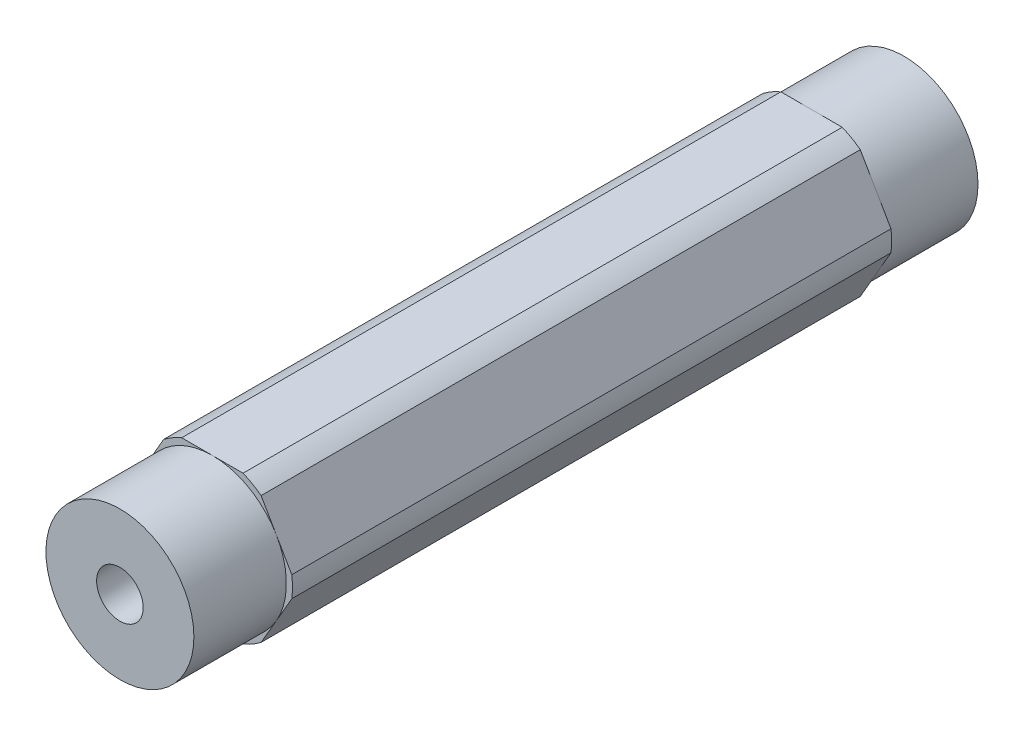
ISO-10303-21;
HEADER;
FILE_DESCRIPTION(('STEP AP214'),'2;1');
FILE_NAME('part.step','',(''),(''),'','','');
FILE_SCHEMA(('AUTOMOTIVE_DESIGN { 1 0 10303 214 1 1 1 1 }'));
ENDSEC;
DATA;
#1=APPLICATION_CONTEXT('core data for automotive mechanical design processes');
#2=APPLICATION_PROTOCOL_DEFINITION('international standard','automotive_design',2000,#1);
#3=PRODUCT_CONTEXT('',#1,'mechanical');
#4=PRODUCT('Part','Part','',(#3));
#5=PRODUCT_RELATED_PRODUCT_CATEGORY('part','',(#4));
#6=PRODUCT_DEFINITION_FORMATION('','',#4);
#7=PRODUCT_DEFINITION_CONTEXT('part definition',#1,'design');
#8=PRODUCT_DEFINITION('design','',#6,#7);
#9=PRODUCT_DEFINITION_SHAPE('','',#8);
#10=(LENGTH_UNIT() NAMED_UNIT(*) SI_UNIT(.MILLI.,.METRE.));
#11=(NAMED_UNIT(*) PLANE_ANGLE_UNIT() SI_UNIT($,.RADIAN.));
#12=(NAMED_UNIT(*) SI_UNIT($,.STERADIAN.) SOLID_ANGLE_UNIT());
#13=UNCERTAINTY_MEASURE_WITH_UNIT(LENGTH_MEASURE(1.E-05),#10,'distance_accuracy_value','');
#14=(GEOMETRIC_REPRESENTATION_CONTEXT(3) GLOBAL_UNCERTAINTY_ASSIGNED_CONTEXT((#13)) GLOBAL_UNIT_ASSIGNED_CONTEXT((#10,
#11,#12)) REPRESENTATION_CONTEXT('',''));
#15=CARTESIAN_POINT('',(0.,0.,0.));
#16=DIRECTION('',(0.,0.,1.));
#17=DIRECTION('',(1.,0.,0.));
#18=AXIS2_PLACEMENT_3D('',#15,#16,#17);
#19=CARTESIAN_POINT('',(0.,0.,-25.7175));
#20=DIRECTION('',(0.,0.,1.));
#21=DIRECTION('',(1.,0.,0.));
#22=AXIS2_PLACEMENT_3D('',#19,#20,#21);
#23=PLANE('',#22);
#24=DIRECTION('',(-0.5,0.866025403784439,0.));
#25=VECTOR('',#24,1.);
#26=CARTESIAN_POINT('',(5.49926131403118,3.175,-25.7175));
#27=LINE('',#26,#25);
#28=CARTESIAN_POINT('',(5.49926131403118,3.175,-25.7175));
#29=VERTEX_POINT('',#28);
#30=CARTESIAN_POINT('',(4.18177084608654,5.45696042896782,-25.7175));
#31=VERTEX_POINT('',#30);
#32=EDGE_CURVE('E182',#29,#31,#27,.T.);
#33=ORIENTED_EDGE('',*,*,#32,.F.);
#34=CARTESIAN_POINT('',(0.,0.,-25.7175));
#35=DIRECTION('',(0.,0.,1.));
#36=DIRECTION('',(1.,0.,0.));
#37=AXIS2_PLACEMENT_3D('',#34,#35,#36);
#38=CIRCLE('',#37,6.35);
#39=CARTESIAN_POINT('',(0.,6.35,-25.7175));
#40=VERTEX_POINT('',#39);
#41=EDGE_CURVE('E57',#29,#40,#38,.T.);
#42=ORIENTED_EDGE('',*,*,#41,.T.);
#43=DIRECTION('',(-1.,0.,0.));
#44=VECTOR('',#43,1.);
#45=CARTESIAN_POINT('',(0.,6.35,-25.7175));
#46=LINE('',#45,#44);
#47=CARTESIAN_POINT('',(2.63498093588929,6.35,-25.7175));
#48=VERTEX_POINT('',#47);
#49=EDGE_CURVE('E181',#48,#40,#46,.T.);
#50=ORIENTED_EDGE('',*,*,#49,.F.);
#51=CARTESIAN_POINT('',(0.,0.,-25.7175));
#52=DIRECTION('',(0.,0.,1.));
#53=DIRECTION('',(1.,0.,0.));
#54=AXIS2_PLACEMENT_3D('',#51,#52,#53);
#55=CIRCLE('',#54,6.874999966);
#56=EDGE_CURVE('E196',#31,#48,#55,.T.);
#57=ORIENTED_EDGE('',*,*,#56,.F.);
#58=EDGE_LOOP('',(#33,#42,#50,#57));
#59=FACE_BOUND('',#58,.T.);
#60=ADVANCED_FACE('F45',(#59),#23,.F.);
#61=CARTESIAN_POINT('',(-2.63498093588929,6.35,-25.7175));
#62=VERTEX_POINT('',#61);
#63=EDGE_CURVE('E189',#40,#62,#46,.T.);
#64=ORIENTED_EDGE('',*,*,#63,.F.);
#65=CARTESIAN_POINT('',(-5.49926131403118,3.175,-25.7175));
#66=VERTEX_POINT('',#65);
#67=EDGE_CURVE('E11',#40,#66,#38,.T.);
#68=ORIENTED_EDGE('',*,*,#67,.T.);
#69=DIRECTION('',(-0.5,-0.866025403784438,0.));
#70=VECTOR('',#69,1.);
#71=CARTESIAN_POINT('',(-5.49926131403118,3.175,-25.7175));
#72=LINE('',#71,#70);
#73=CARTESIAN_POINT('',(-4.18177084608654,5.45696042896783,-25.7175));
#74=VERTEX_POINT('',#73);
#75=EDGE_CURVE('E210',#74,#66,#72,.T.);
#76=ORIENTED_EDGE('',*,*,#75,.F.);
#77=EDGE_CURVE('E191',#62,#74,#55,.T.);
#78=ORIENTED_EDGE('',*,*,#77,.F.);
#79=EDGE_LOOP('',(#64,#68,#76,#78));
#80=FACE_BOUND('',#79,.T.);
#81=ADVANCED_FACE('F190',(#80),#23,.F.);
#82=CARTESIAN_POINT('',(-6.81675178197583,0.893039571032178,-25.7175));
#83=VERTEX_POINT('',#82);
#84=EDGE_CURVE('E205',#66,#83,#72,.T.);
#85=ORIENTED_EDGE('',*,*,#84,.F.);
#86=CARTESIAN_POINT('',(-5.49926131403118,-3.175,-25.7175));
#87=VERTEX_POINT('',#86);
#88=EDGE_CURVE('E55',#66,#87,#38,.T.);
#89=ORIENTED_EDGE('',*,*,#88,.T.);
#90=DIRECTION('',(0.5,-0.866025403784438,0.));
#91=VECTOR('',#90,1.);
#92=CARTESIAN_POINT('',(-5.49926131403118,-3.175,-25.7175));
#93=LINE('',#92,#91);
#94=CARTESIAN_POINT('',(-6.81675178197583,-0.893039571032174,-25.7175));
#95=VERTEX_POINT('',#94);
#96=EDGE_CURVE('E214',#95,#87,#93,.T.);
#97=ORIENTED_EDGE('',*,*,#96,.F.);
#98=EDGE_CURVE('E207',#83,#95,#55,.T.);
#99=ORIENTED_EDGE('',*,*,#98,.F.);
#100=EDGE_LOOP('',(#85,#89,#97,#99));
#101=FACE_BOUND('',#100,.T.);
#102=ADVANCED_FACE('F433',(#101),#23,.F.);
#103=CARTESIAN_POINT('',(-4.18177084608653,-5.45696042896783,-25.7175));
#104=VERTEX_POINT('',#103);
#105=EDGE_CURVE('E219',#87,#104,#93,.T.);
#106=ORIENTED_EDGE('',*,*,#105,.F.);
#107=CARTESIAN_POINT('',(0.,-6.35,-25.7175));
#108=VERTEX_POINT('',#107);
#109=EDGE_CURVE('E397',#87,#108,#38,.T.);
#110=ORIENTED_EDGE('',*,*,#109,.T.);
#111=DIRECTION('',(1.,0.,0.));
#112=VECTOR('',#111,1.);
#113=CARTESIAN_POINT('',(0.,-6.35,-25.7175));
#114=LINE('',#113,#112);
#115=CARTESIAN_POINT('',(-2.6349809358893,-6.35,-25.7175));
#116=VERTEX_POINT('',#115);
#117=EDGE_CURVE('E220',#116,#108,#114,.T.);
#118=ORIENTED_EDGE('',*,*,#117,.F.);
#119=EDGE_CURVE('E218',#104,#116,#55,.T.);
#120=ORIENTED_EDGE('',*,*,#119,.F.);
#121=EDGE_LOOP('',(#106,#110,#118,#120));
#122=FACE_BOUND('',#121,.T.);
#123=ADVANCED_FACE('F396',(#122),#23,.F.);
#124=CARTESIAN_POINT('',(2.6349809358893,-6.35,-25.7175));
#125=VERTEX_POINT('',#124);
#126=EDGE_CURVE('E225',#108,#125,#114,.T.);
#127=ORIENTED_EDGE('',*,*,#126,.F.);
#128=CARTESIAN_POINT('',(5.49926131403118,-3.175,-25.7175));
#129=VERTEX_POINT('',#128);
#130=EDGE_CURVE('E304',#108,#129,#38,.T.);
#131=ORIENTED_EDGE('',*,*,#130,.T.);
#132=DIRECTION('',(0.5,0.866025403784439,0.));
#133=VECTOR('',#132,1.);
#134=CARTESIAN_POINT('',(5.49926131403119,-3.175,-25.7175));
#135=LINE('',#134,#133);
#136=CARTESIAN_POINT('',(4.18177084608654,-5.45696042896782,-25.7175));
#137=VERTEX_POINT('',#136);
#138=EDGE_CURVE('E226',#137,#129,#135,.T.);
#139=ORIENTED_EDGE('',*,*,#138,.F.);
#140=EDGE_CURVE('E224',#125,#137,#55,.T.);
#141=ORIENTED_EDGE('',*,*,#140,.F.);
#142=EDGE_LOOP('',(#127,#131,#139,#141));
#143=FACE_BOUND('',#142,.T.);
#144=ADVANCED_FACE('F416',(#143),#23,.F.);
#145=CARTESIAN_POINT('',(0.,0.,25.7175));
#146=DIRECTION('',(0.,0.,1.));
#147=DIRECTION('',(1.,0.,0.));
#148=AXIS2_PLACEMENT_3D('',#145,#146,#147);
#149=PLANE('',#148);
#150=CARTESIAN_POINT('',(0.,0.,25.7175));
#151=DIRECTION('',(0.,0.,1.));
#152=DIRECTION('',(1.,0.,0.));
#153=AXIS2_PLACEMENT_3D('',#150,#151,#152);
#154=CIRCLE('',#153,6.35);
#155=CARTESIAN_POINT('',(5.49926131403118,3.175,25.7175));
#156=VERTEX_POINT('',#155);
#157=CARTESIAN_POINT('',(0.,6.35,25.7175));
#158=VERTEX_POINT('',#157);
#159=EDGE_CURVE('E280',#156,#158,#154,.T.);
#160=ORIENTED_EDGE('',*,*,#159,.F.);
#161=DIRECTION('',(-0.5,0.866025403784439,0.));
#162=VECTOR('',#161,1.);
#163=CARTESIAN_POINT('',(5.49926131403118,3.175,25.7175));
#164=LINE('',#163,#162);
#165=CARTESIAN_POINT('',(4.18177084608654,5.45696042896782,25.7175));
#166=VERTEX_POINT('',#165);
#167=EDGE_CURVE('E369',#156,#166,#164,.T.);
#168=ORIENTED_EDGE('',*,*,#167,.T.);
#169=CARTESIAN_POINT('',(0.,0.,25.7175));
#170=DIRECTION('',(0.,0.,1.));
#171=DIRECTION('',(1.,0.,0.));
#172=AXIS2_PLACEMENT_3D('',#169,#170,#171);
#173=CIRCLE('',#172,6.874999966);
#174=CARTESIAN_POINT('',(2.63498093588929,6.35,25.7175));
#175=VERTEX_POINT('',#174);
#176=EDGE_CURVE('E355',#166,#175,#173,.T.);
#177=ORIENTED_EDGE('',*,*,#176,.T.);
#178=DIRECTION('',(-1.,0.,0.));
#179=VECTOR('',#178,1.);
#180=CARTESIAN_POINT('',(0.,6.35,25.7175));
#181=LINE('',#180,#179);
#182=EDGE_CURVE('E358',#175,#158,#181,.T.);
#183=ORIENTED_EDGE('',*,*,#182,.T.);
#184=EDGE_LOOP('',(#160,#168,#177,#183));
#185=FACE_BOUND('',#184,.T.);
#186=ADVANCED_FACE('F413',(#185),#149,.T.);
#187=CARTESIAN_POINT('',(-5.49926131403118,3.175,25.7175));
#188=VERTEX_POINT('',#187);
#189=EDGE_CURVE('E291',#158,#188,#154,.T.);
#190=ORIENTED_EDGE('',*,*,#189,.F.);
#191=CARTESIAN_POINT('',(-2.63498093588929,6.35,25.7175));
#192=VERTEX_POINT('',#191);
#193=EDGE_CURVE('E359',#158,#192,#181,.T.);
#194=ORIENTED_EDGE('',*,*,#193,.T.);
#195=CARTESIAN_POINT('',(-4.18177084608654,5.45696042896783,25.7175));
#196=VERTEX_POINT('',#195);
#197=EDGE_CURVE('E362',#192,#196,#173,.T.);
#198=ORIENTED_EDGE('',*,*,#197,.T.);
#199=DIRECTION('',(-0.5,-0.866025403784438,0.));
#200=VECTOR('',#199,1.);
#201=CARTESIAN_POINT('',(-5.49926131403118,3.175,25.7175));
#202=LINE('',#201,#200);
#203=EDGE_CURVE('E338',#196,#188,#202,.T.);
#204=ORIENTED_EDGE('',*,*,#203,.T.);
#205=EDGE_LOOP('',(#190,#194,#198,#204));
#206=FACE_BOUND('',#205,.T.);
#207=ADVANCED_FACE('F415',(#206),#149,.T.);
#208=CARTESIAN_POINT('',(-5.49926131403118,-3.175,25.7175));
#209=VERTEX_POINT('',#208);
#210=EDGE_CURVE('E300',#188,#209,#154,.T.);
#211=ORIENTED_EDGE('',*,*,#210,.F.);
#212=CARTESIAN_POINT('',(-6.81675178197583,0.893039571032178,25.7175));
#213=VERTEX_POINT('',#212);
#214=EDGE_CURVE('E365',#188,#213,#202,.T.);
#215=ORIENTED_EDGE('',*,*,#214,.T.);
#216=CARTESIAN_POINT('',(-6.81675178197583,-0.893039571032174,25.7175));
#217=VERTEX_POINT('',#216);
#218=EDGE_CURVE('E323',#213,#217,#173,.T.);
#219=ORIENTED_EDGE('',*,*,#218,.T.);
#220=DIRECTION('',(0.5,-0.866025403784438,0.));
#221=VECTOR('',#220,1.);
#222=CARTESIAN_POINT('',(-5.49926131403118,-3.175,25.7175));
#223=LINE('',#222,#221);
#224=EDGE_CURVE('E320',#217,#209,#223,.T.);
#225=ORIENTED_EDGE('',*,*,#224,.T.);
#226=EDGE_LOOP('',(#211,#215,#219,#225));
#227=FACE_BOUND('',#226,.T.);
#228=ADVANCED_FACE('F326',(#227),#149,.T.);
#229=CARTESIAN_POINT('',(0.,-6.35,25.7175));
#230=VERTEX_POINT('',#229);
#231=EDGE_CURVE('E285',#209,#230,#154,.T.);
#232=ORIENTED_EDGE('',*,*,#231,.F.);
#233=CARTESIAN_POINT('',(-4.18177084608653,-5.45696042896783,25.7175));
#234=VERTEX_POINT('',#233);
#235=EDGE_CURVE('E312',#209,#234,#223,.T.);
#236=ORIENTED_EDGE('',*,*,#235,.T.);
#237=CARTESIAN_POINT('',(-2.6349809358893,-6.35,25.7175));
#238=VERTEX_POINT('',#237);
#239=EDGE_CURVE('E331',#234,#238,#173,.T.);
#240=ORIENTED_EDGE('',*,*,#239,.T.);
#241=DIRECTION('',(1.,0.,0.));
#242=VECTOR('',#241,1.);
#243=CARTESIAN_POINT('',(0.,-6.35,25.7175));
#244=LINE('',#243,#242);
#245=EDGE_CURVE('E315',#238,#230,#244,.T.);
#246=ORIENTED_EDGE('',*,*,#245,.T.);
#247=EDGE_LOOP('',(#232,#236,#240,#246));
#248=FACE_BOUND('',#247,.T.);
#249=ADVANCED_FACE('F311',(#248),#149,.T.);
#250=CARTESIAN_POINT('',(5.49926131403119,-3.175,25.7175));
#251=VERTEX_POINT('',#250);
#252=EDGE_CURVE('E278',#230,#251,#154,.T.);
#253=ORIENTED_EDGE('',*,*,#252,.F.);
#254=CARTESIAN_POINT('',(2.6349809358893,-6.35,25.7175));
#255=VERTEX_POINT('',#254);
#256=EDGE_CURVE('E333',#230,#255,#244,.T.);
#257=ORIENTED_EDGE('',*,*,#256,.T.);
#258=CARTESIAN_POINT('',(4.18177084608654,-5.45696042896782,25.7175));
#259=VERTEX_POINT('',#258);
#260=EDGE_CURVE('E335',#255,#259,#173,.T.);
#261=ORIENTED_EDGE('',*,*,#260,.T.);
#262=DIRECTION('',(0.5,0.866025403784439,0.));
#263=VECTOR('',#262,1.);
#264=CARTESIAN_POINT('',(5.49926131403119,-3.175,25.7175));
#265=LINE('',#264,#263);
#266=EDGE_CURVE('E342',#259,#251,#265,.T.);
#267=ORIENTED_EDGE('',*,*,#266,.T.);
#268=EDGE_LOOP('',(#253,#257,#261,#267));
#269=FACE_BOUND('',#268,.T.);
#270=ADVANCED_FACE('F428',(#269),#149,.T.);
#271=CARTESIAN_POINT('',(5.49926131403118,3.175,25.7175));
#272=DIRECTION('',(-0.866025403784438,-0.5,0.));
#273=DIRECTION('',(0.5,-0.866025403784439,0.));
#274=AXIS2_PLACEMENT_3D('',#271,#272,#273);
#275=PLANE('',#274);
#276=CARTESIAN_POINT('',(6.81675178197583,0.89303957103218,-25.7175));
#277=VERTEX_POINT('',#276);
#278=EDGE_CURVE('E346',#277,#29,#27,.T.);
#279=ORIENTED_EDGE('',*,*,#278,.T.);
#280=ORIENTED_EDGE('',*,*,#32,.T.);
#281=DIRECTION('',(0.,0.,-1.));
#282=VECTOR('',#281,1.);
#283=CARTESIAN_POINT('',(4.18177084608654,5.45696042896782,25.7175));
#284=LINE('',#283,#282);
#285=EDGE_CURVE('E49',#166,#31,#284,.T.);
#286=ORIENTED_EDGE('',*,*,#285,.F.);
#287=ORIENTED_EDGE('',*,*,#167,.F.);
#288=CARTESIAN_POINT('',(6.81675178197583,0.89303957103218,25.7175));
#289=VERTEX_POINT('',#288);
#290=EDGE_CURVE('E367',#289,#156,#164,.T.);
#291=ORIENTED_EDGE('',*,*,#290,.F.);
#292=DIRECTION('',(0.,0.,-1.));
#293=VECTOR('',#292,1.);
#294=CARTESIAN_POINT('',(6.81675178197583,0.89303957103218,25.7175));
#295=LINE('',#294,#293);
#296=EDGE_CURVE('E232',#289,#277,#295,.T.);
#297=ORIENTED_EDGE('',*,*,#296,.T.);
#298=EDGE_LOOP('',(#279,#280,#286,#287,#291,#297));
#299=FACE_BOUND('',#298,.T.);
#300=ADVANCED_FACE('F352',(#299),#275,.F.);
#301=CARTESIAN_POINT('',(0.,0.,25.7175));
#302=DIRECTION('',(0.,0.,-1.));
#303=DIRECTION('',(-1.,0.,0.));
#304=AXIS2_PLACEMENT_3D('',#301,#302,#303);
#305=CYLINDRICAL_SURFACE('',#304,6.874999966);
#306=ORIENTED_EDGE('',*,*,#56,.T.);
#307=DIRECTION('',(0.,0.,-1.));
#308=VECTOR('',#307,1.);
#309=CARTESIAN_POINT('',(2.63498093588929,6.35,25.7175));
#310=LINE('',#309,#308);
#311=EDGE_CURVE('E202',#175,#48,#310,.T.);
#312=ORIENTED_EDGE('',*,*,#311,.F.);
#313=ORIENTED_EDGE('',*,*,#176,.F.);
#314=ORIENTED_EDGE('',*,*,#285,.T.);
#315=EDGE_LOOP('',(#306,#312,#313,#314));
#316=FACE_BOUND('',#315,.T.);
#317=ADVANCED_FACE('F354',(#316),#305,.T.);
#318=CARTESIAN_POINT('',(0.,6.35,25.7175));
#319=DIRECTION('',(0.,-1.,0.));
#320=DIRECTION('',(0.,0.,-1.));
#321=AXIS2_PLACEMENT_3D('',#318,#319,#320);
#322=PLANE('',#321);
#323=ORIENTED_EDGE('',*,*,#49,.T.);
#324=ORIENTED_EDGE('',*,*,#63,.T.);
#325=DIRECTION('',(0.,0.,-1.));
#326=VECTOR('',#325,1.);
#327=CARTESIAN_POINT('',(-2.63498093588929,6.35,25.7175));
#328=LINE('',#327,#326);
#329=EDGE_CURVE('E269',#192,#62,#328,.T.);
#330=ORIENTED_EDGE('',*,*,#329,.F.);
#331=ORIENTED_EDGE('',*,*,#193,.F.);
#332=ORIENTED_EDGE('',*,*,#182,.F.);
#333=ORIENTED_EDGE('',*,*,#311,.T.);
#334=EDGE_LOOP('',(#323,#324,#330,#331,#332,#333));
#335=FACE_BOUND('',#334,.T.);
#336=ADVANCED_FACE('F199',(#335),#322,.F.);
#337=ORIENTED_EDGE('',*,*,#77,.T.);
#338=DIRECTION('',(0.,0.,-1.));
#339=VECTOR('',#338,1.);
#340=CARTESIAN_POINT('',(-4.18177084608654,5.45696042896783,25.7175));
#341=LINE('',#340,#339);
#342=EDGE_CURVE('E265',#196,#74,#341,.T.);
#343=ORIENTED_EDGE('',*,*,#342,.F.);
#344=ORIENTED_EDGE('',*,*,#197,.F.);
#345=ORIENTED_EDGE('',*,*,#329,.T.);
#346=EDGE_LOOP('',(#337,#343,#344,#345));
#347=FACE_BOUND('',#346,.T.);
#348=ADVANCED_FACE('F484',(#347),#305,.T.);
#349=CARTESIAN_POINT('',(-5.49926131403118,3.175,25.7175));
#350=DIRECTION('',(0.866025403784438,-0.5,0.));
#351=DIRECTION('',(0.5,0.866025403784438,0.));
#352=AXIS2_PLACEMENT_3D('',#349,#350,#351);
#353=PLANE('',#352);
#354=ORIENTED_EDGE('',*,*,#75,.T.);
#355=ORIENTED_EDGE('',*,*,#84,.T.);
#356=DIRECTION('',(0.,0.,-1.));
#357=VECTOR('',#356,1.);
#358=CARTESIAN_POINT('',(-6.81675178197583,0.893039571032178,25.7175));
#359=LINE('',#358,#357);
#360=EDGE_CURVE('E261',#213,#83,#359,.T.);
#361=ORIENTED_EDGE('',*,*,#360,.F.);
#362=ORIENTED_EDGE('',*,*,#214,.F.);
#363=ORIENTED_EDGE('',*,*,#203,.F.);
#364=ORIENTED_EDGE('',*,*,#342,.T.);
#365=EDGE_LOOP('',(#354,#355,#361,#362,#363,#364));
#366=FACE_BOUND('',#365,.T.);
#367=ADVANCED_FACE('F481',(#366),#353,.F.);
#368=ORIENTED_EDGE('',*,*,#98,.T.);
#369=DIRECTION('',(0.,0.,-1.));
#370=VECTOR('',#369,1.);
#371=CARTESIAN_POINT('',(-6.81675178197583,-0.893039571032174,25.7175));
#372=LINE('',#371,#370);
#373=EDGE_CURVE('E257',#217,#95,#372,.T.);
#374=ORIENTED_EDGE('',*,*,#373,.F.);
#375=ORIENTED_EDGE('',*,*,#218,.F.);
#376=ORIENTED_EDGE('',*,*,#360,.T.);
#377=EDGE_LOOP('',(#368,#374,#375,#376));
#378=FACE_BOUND('',#377,.T.);
#379=ADVANCED_FACE('F480',(#378),#305,.T.);
#380=CARTESIAN_POINT('',(-5.49926131403118,-3.175,25.7175));
#381=DIRECTION('',(0.866025403784438,0.5,0.));
#382=DIRECTION('',(-0.5,0.866025403784438,0.));
#383=AXIS2_PLACEMENT_3D('',#380,#381,#382);
#384=PLANE('',#383);
#385=ORIENTED_EDGE('',*,*,#96,.T.);
#386=ORIENTED_EDGE('',*,*,#105,.T.);
#387=DIRECTION('',(0.,0.,-1.));
#388=VECTOR('',#387,1.);
#389=CARTESIAN_POINT('',(-4.18177084608653,-5.45696042896783,25.7175));
#390=LINE('',#389,#388);
#391=EDGE_CURVE('E253',#234,#104,#390,.T.);
#392=ORIENTED_EDGE('',*,*,#391,.F.);
#393=ORIENTED_EDGE('',*,*,#235,.F.);
#394=ORIENTED_EDGE('',*,*,#224,.F.);
#395=ORIENTED_EDGE('',*,*,#373,.T.);
#396=EDGE_LOOP('',(#385,#386,#392,#393,#394,#395));
#397=FACE_BOUND('',#396,.T.);
#398=ADVANCED_FACE('F319',(#397),#384,.F.);
#399=ORIENTED_EDGE('',*,*,#119,.T.);
#400=DIRECTION('',(0.,0.,-1.));
#401=VECTOR('',#400,1.);
#402=CARTESIAN_POINT('',(-2.6349809358893,-6.35,25.7175));
#403=LINE('',#402,#401);
#404=EDGE_CURVE('E249',#238,#116,#403,.T.);
#405=ORIENTED_EDGE('',*,*,#404,.F.);
#406=ORIENTED_EDGE('',*,*,#239,.F.);
#407=ORIENTED_EDGE('',*,*,#391,.T.);
#408=EDGE_LOOP('',(#399,#405,#406,#407));
#409=FACE_BOUND('',#408,.T.);
#410=ADVANCED_FACE('F394',(#409),#305,.T.);
#411=CARTESIAN_POINT('',(0.,-6.35,25.7175));
#412=DIRECTION('',(0.,1.,0.));
#413=DIRECTION('',(0.,0.,1.));
#414=AXIS2_PLACEMENT_3D('',#411,#412,#413);
#415=PLANE('',#414);
#416=ORIENTED_EDGE('',*,*,#117,.T.);
#417=ORIENTED_EDGE('',*,*,#126,.T.);
#418=DIRECTION('',(0.,0.,-1.));
#419=VECTOR('',#418,1.);
#420=CARTESIAN_POINT('',(2.6349809358893,-6.35,25.7175));
#421=LINE('',#420,#419);
#422=EDGE_CURVE('E245',#255,#125,#421,.T.);
#423=ORIENTED_EDGE('',*,*,#422,.F.);
#424=ORIENTED_EDGE('',*,*,#256,.F.);
#425=ORIENTED_EDGE('',*,*,#245,.F.);
#426=ORIENTED_EDGE('',*,*,#404,.T.);
#427=EDGE_LOOP('',(#416,#417,#423,#424,#425,#426));
#428=FACE_BOUND('',#427,.T.);
#429=ADVANCED_FACE('F400',(#428),#415,.F.);
#430=ORIENTED_EDGE('',*,*,#140,.T.);
#431=DIRECTION('',(0.,0.,-1.));
#432=VECTOR('',#431,1.);
#433=CARTESIAN_POINT('',(4.18177084608654,-5.45696042896782,25.7175));
#434=LINE('',#433,#432);
#435=EDGE_CURVE('E241',#259,#137,#434,.T.);
#436=ORIENTED_EDGE('',*,*,#435,.F.);
#437=ORIENTED_EDGE('',*,*,#260,.F.);
#438=ORIENTED_EDGE('',*,*,#422,.T.);
#439=EDGE_LOOP('',(#430,#436,#437,#438));
#440=FACE_BOUND('',#439,.T.);
#441=ADVANCED_FACE('F468',(#440),#305,.T.);
#442=CARTESIAN_POINT('',(5.49926131403119,-3.175,25.7175));
#443=DIRECTION('',(-0.866025403784439,0.5,0.));
#444=DIRECTION('',(-0.5,-0.866025403784439,0.));
#445=AXIS2_PLACEMENT_3D('',#442,#443,#444);
#446=PLANE('',#445);
#447=ORIENTED_EDGE('',*,*,#138,.T.);
#448=CARTESIAN_POINT('',(6.81675178197583,-0.893039571032182,-25.7175));
#449=VERTEX_POINT('',#448);
#450=EDGE_CURVE('E231',#129,#449,#135,.T.);
#451=ORIENTED_EDGE('',*,*,#450,.T.);
#452=DIRECTION('',(0.,0.,-1.));
#453=VECTOR('',#452,1.);
#454=CARTESIAN_POINT('',(6.81675178197583,-0.893039571032182,25.7175));
#455=LINE('',#454,#453);
#456=CARTESIAN_POINT('',(6.81675178197583,-0.893039571032182,25.7175));
#457=VERTEX_POINT('',#456);
#458=EDGE_CURVE('E236',#457,#449,#455,.T.);
#459=ORIENTED_EDGE('',*,*,#458,.F.);
#460=EDGE_CURVE('E345',#251,#457,#265,.T.);
#461=ORIENTED_EDGE('',*,*,#460,.F.);
#462=ORIENTED_EDGE('',*,*,#266,.F.);
#463=ORIENTED_EDGE('',*,*,#435,.T.);
#464=EDGE_LOOP('',(#447,#451,#459,#461,#462,#463));
#465=FACE_BOUND('',#464,.T.);
#466=ADVANCED_FACE('F446',(#465),#446,.F.);
#467=CARTESIAN_POINT('',(0.,0.,25.7175));
#468=DIRECTION('',(0.,0.,-1.));
#469=DIRECTION('',(-1.,0.,0.));
#470=AXIS2_PLACEMENT_3D('',#467,#468,#469);
#471=CYLINDRICAL_SURFACE('',#470,2.000000064);
#472=CARTESIAN_POINT('',(0.,0.,33.655));
#473=DIRECTION('',(0.,0.,1.));
#474=DIRECTION('',(1.,0.,0.));
#475=AXIS2_PLACEMENT_3D('',#472,#473,#474);
#476=CIRCLE('',#475,2.000000064);
#477=CARTESIAN_POINT('',(2.000000064,0.,33.655));
#478=VERTEX_POINT('',#477);
#479=EDGE_CURVE('E290',#478,#478,#476,.T.);
#480=ORIENTED_EDGE('',*,*,#479,.T.);
#481=EDGE_LOOP('',(#480));
#482=FACE_BOUND('',#481,.T.);
#483=CARTESIAN_POINT('',(0.,0.,-33.655));
#484=DIRECTION('',(0.,0.,1.));
#485=DIRECTION('',(1.,0.,0.));
#486=AXIS2_PLACEMENT_3D('',#483,#484,#485);
#487=CIRCLE('',#486,2.000000064);
#488=CARTESIAN_POINT('',(2.000000064,0.,-33.655));
#489=VERTEX_POINT('',#488);
#490=EDGE_CURVE('E186',#489,#489,#487,.T.);
#491=ORIENTED_EDGE('',*,*,#490,.F.);
#492=EDGE_LOOP('',(#491));
#493=FACE_BOUND('',#492,.T.);
#494=ADVANCED_FACE('F47',(#482,#493),#471,.F.);
#495=EDGE_CURVE('E230',#449,#277,#55,.T.);
#496=ORIENTED_EDGE('',*,*,#495,.T.);
#497=ORIENTED_EDGE('',*,*,#296,.F.);
#498=EDGE_CURVE('E237',#457,#289,#173,.T.);
#499=ORIENTED_EDGE('',*,*,#498,.F.);
#500=ORIENTED_EDGE('',*,*,#458,.T.);
#501=EDGE_LOOP('',(#496,#497,#499,#500));
#502=FACE_BOUND('',#501,.T.);
#503=ADVANCED_FACE('F412',(#502),#305,.T.);
#504=EDGE_CURVE('E71',#251,#156,#154,.T.);
#505=ORIENTED_EDGE('',*,*,#504,.F.);
#506=ORIENTED_EDGE('',*,*,#460,.T.);
#507=ORIENTED_EDGE('',*,*,#498,.T.);
#508=ORIENTED_EDGE('',*,*,#290,.T.);
#509=EDGE_LOOP('',(#505,#506,#507,#508));
#510=FACE_BOUND('',#509,.T.);
#511=ADVANCED_FACE('F410',(#510),#149,.T.);
#512=ORIENTED_EDGE('',*,*,#450,.F.);
#513=EDGE_CURVE('E187',#129,#29,#38,.T.);
#514=ORIENTED_EDGE('',*,*,#513,.T.);
#515=ORIENTED_EDGE('',*,*,#278,.F.);
#516=ORIENTED_EDGE('',*,*,#495,.F.);
#517=EDGE_LOOP('',(#512,#514,#515,#516));
#518=FACE_BOUND('',#517,.T.);
#519=ADVANCED_FACE('F425',(#518),#23,.F.);
#520=CARTESIAN_POINT('',(0.,0.,33.655));
#521=DIRECTION('',(0.,0.,1.));
#522=DIRECTION('',(1.,0.,0.));
#523=AXIS2_PLACEMENT_3D('',#520,#521,#522);
#524=PLANE('',#523);
#525=CARTESIAN_POINT('',(0.,0.,33.655));
#526=DIRECTION('',(0.,0.,1.));
#527=DIRECTION('',(1.,0.,0.));
#528=AXIS2_PLACEMENT_3D('',#525,#526,#527);
#529=CIRCLE('',#528,6.35);
#530=CARTESIAN_POINT('',(6.35,0.,33.655));
#531=VERTEX_POINT('',#530);
#532=EDGE_CURVE('E289',#531,#531,#529,.T.);
#533=ORIENTED_EDGE('',*,*,#532,.T.);
#534=EDGE_LOOP('',(#533));
#535=FACE_BOUND('',#534,.T.);
#536=ORIENTED_EDGE('',*,*,#479,.F.);
#537=EDGE_LOOP('',(#536));
#538=FACE_BOUND('',#537,.T.);
#539=ADVANCED_FACE('F436',(#535,#538),#524,.T.);
#540=CARTESIAN_POINT('',(0.,0.,33.655));
#541=DIRECTION('',(0.,0.,-1.));
#542=DIRECTION('',(-1.,0.,0.));
#543=AXIS2_PLACEMENT_3D('',#540,#541,#542);
#544=CYLINDRICAL_SURFACE('',#543,6.35);
#545=ORIENTED_EDGE('',*,*,#532,.F.);
#546=EDGE_LOOP('',(#545));
#547=FACE_BOUND('',#546,.T.);
#548=ORIENTED_EDGE('',*,*,#159,.T.);
#549=ORIENTED_EDGE('',*,*,#189,.T.);
#550=ORIENTED_EDGE('',*,*,#210,.T.);
#551=ORIENTED_EDGE('',*,*,#231,.T.);
#552=ORIENTED_EDGE('',*,*,#252,.T.);
#553=ORIENTED_EDGE('',*,*,#504,.T.);
#554=EDGE_LOOP('',(#548,#549,#550,#551,#552,#553));
#555=FACE_BOUND('',#554,.T.);
#556=ADVANCED_FACE('F307',(#547,#555),#544,.T.);
#557=CARTESIAN_POINT('',(0.,0.,-33.655));
#558=DIRECTION('',(0.,0.,1.));
#559=DIRECTION('',(1.,0.,0.));
#560=AXIS2_PLACEMENT_3D('',#557,#558,#559);
#561=CYLINDRICAL_SURFACE('',#560,6.35);
#562=CARTESIAN_POINT('',(0.,0.,-33.655));
#563=DIRECTION('',(0.,0.,1.));
#564=DIRECTION('',(1.,0.,0.));
#565=AXIS2_PLACEMENT_3D('',#562,#563,#564);
#566=CIRCLE('',#565,6.35);
#567=CARTESIAN_POINT('',(6.35,0.,-33.655));
#568=VERTEX_POINT('',#567);
#569=EDGE_CURVE('E185',#568,#568,#566,.T.);
#570=ORIENTED_EDGE('',*,*,#569,.T.);
#571=EDGE_LOOP('',(#570));
#572=FACE_BOUND('',#571,.T.);
#573=ORIENTED_EDGE('',*,*,#41,.F.);
#574=ORIENTED_EDGE('',*,*,#513,.F.);
#575=ORIENTED_EDGE('',*,*,#130,.F.);
#576=ORIENTED_EDGE('',*,*,#109,.F.);
#577=ORIENTED_EDGE('',*,*,#88,.F.);
#578=ORIENTED_EDGE('',*,*,#67,.F.);
#579=EDGE_LOOP('',(#573,#574,#575,#576,#577,#578));
#580=FACE_BOUND('',#579,.T.);
#581=ADVANCED_FACE('F170',(#572,#580),#561,.T.);
#582=CARTESIAN_POINT('',(0.,0.,-33.655));
#583=DIRECTION('',(0.,0.,-1.));
#584=DIRECTION('',(1.,0.,0.));
#585=AXIS2_PLACEMENT_3D('',#582,#583,#584);
#586=PLANE('',#585);
#587=ORIENTED_EDGE('',*,*,#490,.T.);
#588=EDGE_LOOP('',(#587));
#589=FACE_BOUND('',#588,.T.);
#590=ORIENTED_EDGE('',*,*,#569,.F.);
#591=EDGE_LOOP('',(#590));
#592=FACE_BOUND('',#591,.T.);
#593=ADVANCED_FACE('F459',(#589,#592),#586,.T.);
#594=CLOSED_SHELL('',(#60,#81,#102,#123,#144,#186,#207,#228,#249,#270,#300,#317,#336,#348,#367,
#379,#398,#410,#429,#441,#466,#494,#503,#511,#519,#539,#556,#581,#593));
#595=MANIFOLD_SOLID_BREP('B2',#594);
#596=ADVANCED_BREP_SHAPE_REPRESENTATION('',(#18,#595),#14);
#597=SHAPE_DEFINITION_REPRESENTATION(#9,#596);
ENDSEC;
END-ISO-10303-21;
